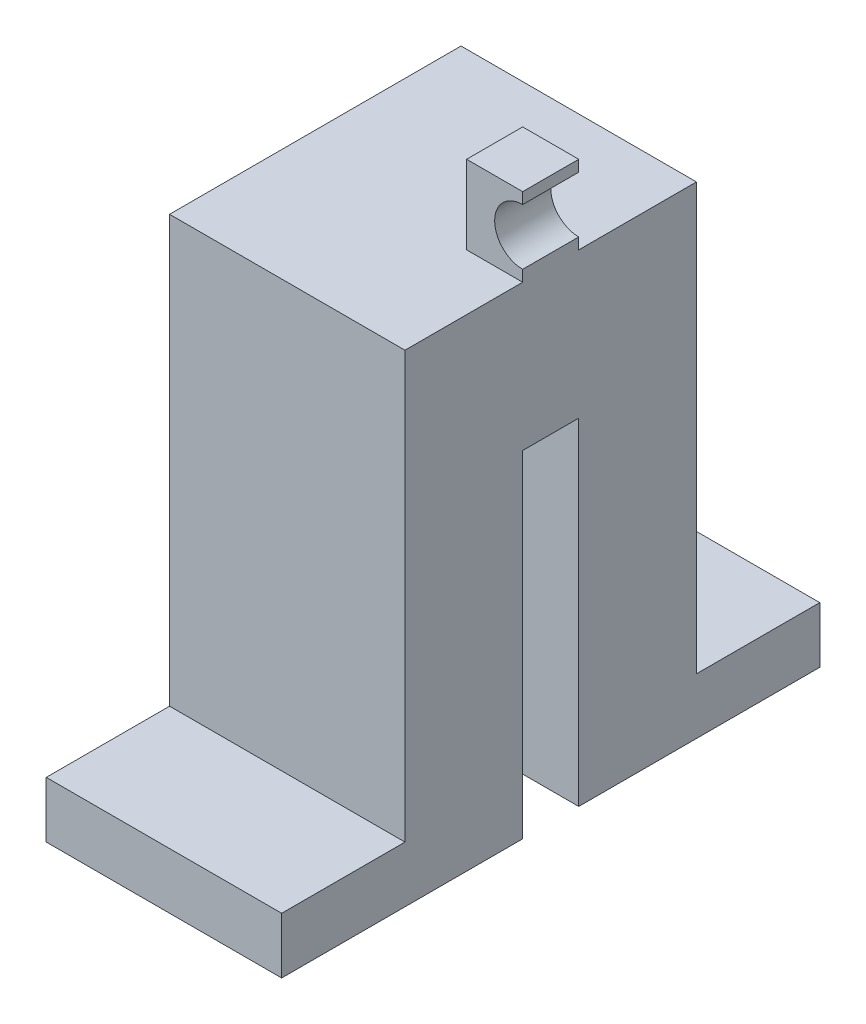
ISO-10303-21;
HEADER;
FILE_DESCRIPTION(('STEP AP214'),'2;1');
FILE_NAME('part.step','',(''),(''),'','','');
FILE_SCHEMA(('AUTOMOTIVE_DESIGN { 1 0 10303 214 1 1 1 1 }'));
ENDSEC;
DATA;
#1=APPLICATION_CONTEXT('core data for automotive mechanical design processes');
#2=APPLICATION_PROTOCOL_DEFINITION('international standard','automotive_design',2000,#1);
#3=PRODUCT_CONTEXT('',#1,'mechanical');
#4=PRODUCT('Part','Part','',(#3));
#5=PRODUCT_RELATED_PRODUCT_CATEGORY('part','',(#4));
#6=PRODUCT_DEFINITION_FORMATION('','',#4);
#7=PRODUCT_DEFINITION_CONTEXT('part definition',#1,'design');
#8=PRODUCT_DEFINITION('design','',#6,#7);
#9=PRODUCT_DEFINITION_SHAPE('','',#8);
#10=(LENGTH_UNIT() NAMED_UNIT(*) SI_UNIT(.MILLI.,.METRE.));
#11=(NAMED_UNIT(*) PLANE_ANGLE_UNIT() SI_UNIT($,.RADIAN.));
#12=(NAMED_UNIT(*) SI_UNIT($,.STERADIAN.) SOLID_ANGLE_UNIT());
#13=UNCERTAINTY_MEASURE_WITH_UNIT(LENGTH_MEASURE(1.E-05),#10,'distance_accuracy_value','');
#14=(GEOMETRIC_REPRESENTATION_CONTEXT(3) GLOBAL_UNCERTAINTY_ASSIGNED_CONTEXT((#13)) GLOBAL_UNIT_ASSIGNED_CONTEXT((#10,
#11,#12)) REPRESENTATION_CONTEXT('',''));
#15=CARTESIAN_POINT('',(0.,0.,0.));
#16=DIRECTION('',(0.,0.,1.));
#17=DIRECTION('',(1.,0.,0.));
#18=AXIS2_PLACEMENT_3D('',#15,#16,#17);
#19=CARTESIAN_POINT('',(21.,50.,-8.5));
#20=DIRECTION('',(1.,0.,0.));
#21=DIRECTION('',(0.,0.,-1.));
#22=AXIS2_PLACEMENT_3D('',#19,#20,#21);
#23=PLANE('',#22);
#24=DIRECTION('',(0.,0.,-1.));
#25=VECTOR('',#24,1.);
#26=CARTESIAN_POINT('',(21.,43.,2.5));
#27=LINE('',#26,#25);
#28=CARTESIAN_POINT('',(21.,43.,13.));
#29=VERTEX_POINT('',#28);
#30=CARTESIAN_POINT('',(21.,43.,2.5));
#31=VERTEX_POINT('',#30);
#32=EDGE_CURVE('E286',#29,#31,#27,.T.);
#33=ORIENTED_EDGE('',*,*,#32,.F.);
#34=DIRECTION('',(0.,-1.,0.));
#35=VECTOR('',#34,1.);
#36=CARTESIAN_POINT('',(21.,43.,13.));
#37=LINE('',#36,#35);
#38=CARTESIAN_POINT('',(21.,5.,13.));
#39=VERTEX_POINT('',#38);
#40=EDGE_CURVE('E265',#29,#39,#37,.T.);
#41=ORIENTED_EDGE('',*,*,#40,.T.);
#42=DIRECTION('',(0.,0.,-1.));
#43=VECTOR('',#42,1.);
#44=CARTESIAN_POINT('',(21.,5.,24.));
#45=LINE('',#44,#43);
#46=CARTESIAN_POINT('',(21.,5.,24.));
#47=VERTEX_POINT('',#46);
#48=EDGE_CURVE('E258',#47,#39,#45,.T.);
#49=ORIENTED_EDGE('',*,*,#48,.F.);
#50=DIRECTION('',(0.,1.,0.));
#51=VECTOR('',#50,1.);
#52=CARTESIAN_POINT('',(21.,0.,24.));
#53=LINE('',#52,#51);
#54=CARTESIAN_POINT('',(21.,0.,24.));
#55=VERTEX_POINT('',#54);
#56=EDGE_CURVE('E250',#55,#47,#53,.T.);
#57=ORIENTED_EDGE('',*,*,#56,.F.);
#58=DIRECTION('',(0.,0.,1.));
#59=VECTOR('',#58,1.);
#60=CARTESIAN_POINT('',(21.,0.,-8.5));
#61=LINE('',#60,#59);
#62=CARTESIAN_POINT('',(21.,0.,2.5));
#63=VERTEX_POINT('',#62);
#64=EDGE_CURVE('E362',#63,#55,#61,.T.);
#65=ORIENTED_EDGE('',*,*,#64,.F.);
#66=DIRECTION('',(0.,1.,0.));
#67=VECTOR('',#66,1.);
#68=CARTESIAN_POINT('',(21.,-73.0368057899577,2.5));
#69=LINE('',#68,#67);
#70=CARTESIAN_POINT('',(21.,30.,2.5));
#71=VERTEX_POINT('',#70);
#72=EDGE_CURVE('E312',#63,#71,#69,.T.);
#73=ORIENTED_EDGE('',*,*,#72,.T.);
#74=DIRECTION('',(0.,0.,1.));
#75=VECTOR('',#74,1.);
#76=CARTESIAN_POINT('',(21.,30.,-8.5));
#77=LINE('',#76,#75);
#78=CARTESIAN_POINT('',(21.,30.,-2.5));
#79=VERTEX_POINT('',#78);
#80=EDGE_CURVE('E308',#79,#71,#77,.T.);
#81=ORIENTED_EDGE('',*,*,#80,.F.);
#82=DIRECTION('',(0.,1.,0.));
#83=VECTOR('',#82,1.);
#84=CARTESIAN_POINT('',(21.,-73.0368057899577,-2.5));
#85=LINE('',#84,#83);
#86=CARTESIAN_POINT('',(21.,0.,-2.5));
#87=VERTEX_POINT('',#86);
#88=EDGE_CURVE('E325',#87,#79,#85,.T.);
#89=ORIENTED_EDGE('',*,*,#88,.F.);
#90=CARTESIAN_POINT('',(21.,0.,-24.));
#91=VERTEX_POINT('',#90);
#92=EDGE_CURVE('E223',#91,#87,#61,.T.);
#93=ORIENTED_EDGE('',*,*,#92,.F.);
#94=DIRECTION('',(0.,-1.,0.));
#95=VECTOR('',#94,1.);
#96=CARTESIAN_POINT('',(21.,5.,-24.));
#97=LINE('',#96,#95);
#98=CARTESIAN_POINT('',(21.,5.,-24.));
#99=VERTEX_POINT('',#98);
#100=EDGE_CURVE('E237',#99,#91,#97,.T.);
#101=ORIENTED_EDGE('',*,*,#100,.F.);
#102=DIRECTION('',(0.,0.,1.));
#103=VECTOR('',#102,1.);
#104=CARTESIAN_POINT('',(21.,5.,-24.));
#105=LINE('',#104,#103);
#106=CARTESIAN_POINT('',(21.,5.,-13.));
#107=VERTEX_POINT('',#106);
#108=EDGE_CURVE('E242',#99,#107,#105,.T.);
#109=ORIENTED_EDGE('',*,*,#108,.T.);
#110=DIRECTION('',(0.,-1.,0.));
#111=VECTOR('',#110,1.);
#112=CARTESIAN_POINT('',(21.,43.,-13.));
#113=LINE('',#112,#111);
#114=CARTESIAN_POINT('',(21.,43.,-13.));
#115=VERTEX_POINT('',#114);
#116=EDGE_CURVE('E272',#115,#107,#113,.T.);
#117=ORIENTED_EDGE('',*,*,#116,.F.);
#118=DIRECTION('',(0.,0.,-1.));
#119=VECTOR('',#118,1.);
#120=CARTESIAN_POINT('',(21.,43.,-2.5));
#121=LINE('',#120,#119);
#122=CARTESIAN_POINT('',(21.,43.,-2.5));
#123=VERTEX_POINT('',#122);
#124=EDGE_CURVE('E292',#123,#115,#121,.T.);
#125=ORIENTED_EDGE('',*,*,#124,.F.);
#126=DIRECTION('',(0.,-1.,0.));
#127=VECTOR('',#126,1.);
#128=CARTESIAN_POINT('',(21.,50.,-2.5));
#129=LINE('',#128,#127);
#130=CARTESIAN_POINT('',(21.,44.,-2.5));
#131=VERTEX_POINT('',#130);
#132=EDGE_CURVE('E293',#131,#123,#129,.T.);
#133=ORIENTED_EDGE('',*,*,#132,.F.);
#134=DIRECTION('',(0.,0.,-1.));
#135=VECTOR('',#134,1.);
#136=CARTESIAN_POINT('',(21.,44.,27.5));
#137=LINE('',#136,#135);
#138=CARTESIAN_POINT('',(21.,44.,2.5));
#139=VERTEX_POINT('',#138);
#140=EDGE_CURVE('E12',#139,#131,#137,.T.);
#141=ORIENTED_EDGE('',*,*,#140,.F.);
#142=DIRECTION('',(0.,1.,0.));
#143=VECTOR('',#142,1.);
#144=CARTESIAN_POINT('',(21.,50.,2.5));
#145=LINE('',#144,#143);
#146=EDGE_CURVE('E301',#31,#139,#145,.T.);
#147=ORIENTED_EDGE('',*,*,#146,.F.);
#148=EDGE_LOOP('',(#33,#41,#49,#57,#65,#73,#81,#89,#93,#101,#109,#117,#125,#133,#141,#147));
#149=FACE_BOUND('',#148,.T.);
#150=ADVANCED_FACE('F61',(#149),#23,.T.);
#151=CARTESIAN_POINT('',(0.,0.,0.));
#152=DIRECTION('',(0.,-1.,0.));
#153=DIRECTION('',(0.,0.,-1.));
#154=AXIS2_PLACEMENT_3D('',#151,#152,#153);
#155=PLANE('',#154);
#156=ORIENTED_EDGE('',*,*,#64,.T.);
#157=DIRECTION('',(1.,0.,0.));
#158=VECTOR('',#157,1.);
#159=CARTESIAN_POINT('',(0.,0.,24.));
#160=LINE('',#159,#158);
#161=CARTESIAN_POINT('',(0.,0.,24.));
#162=VERTEX_POINT('',#161);
#163=EDGE_CURVE('E218',#162,#55,#160,.T.);
#164=ORIENTED_EDGE('',*,*,#163,.F.);
#165=DIRECTION('',(0.,0.,-1.));
#166=VECTOR('',#165,1.);
#167=CARTESIAN_POINT('',(0.,0.,-1.));
#168=LINE('',#167,#166);
#169=CARTESIAN_POINT('',(0.,0.,-24.));
#170=VERTEX_POINT('',#169);
#171=EDGE_CURVE('E211',#162,#170,#168,.T.);
#172=ORIENTED_EDGE('',*,*,#171,.T.);
#173=DIRECTION('',(-1.,0.,0.));
#174=VECTOR('',#173,1.);
#175=CARTESIAN_POINT('',(21.,0.,-24.));
#176=LINE('',#175,#174);
#177=EDGE_CURVE('E216',#91,#170,#176,.T.);
#178=ORIENTED_EDGE('',*,*,#177,.F.);
#179=ORIENTED_EDGE('',*,*,#92,.T.);
#180=DIRECTION('',(1.,0.,0.));
#181=VECTOR('',#180,1.);
#182=CARTESIAN_POINT('',(21.,0.,-2.5));
#183=LINE('',#182,#181);
#184=CARTESIAN_POINT('',(14.,0.,-2.5));
#185=VERTEX_POINT('',#184);
#186=EDGE_CURVE('E315',#185,#87,#183,.T.);
#187=ORIENTED_EDGE('',*,*,#186,.F.);
#188=DIRECTION('',(0.,0.,-1.));
#189=VECTOR('',#188,1.);
#190=CARTESIAN_POINT('',(14.,0.,2.5));
#191=LINE('',#190,#189);
#192=CARTESIAN_POINT('',(14.,0.,2.5));
#193=VERTEX_POINT('',#192);
#194=EDGE_CURVE('E311',#193,#185,#191,.T.);
#195=ORIENTED_EDGE('',*,*,#194,.F.);
#196=DIRECTION('',(-1.,0.,0.));
#197=VECTOR('',#196,1.);
#198=CARTESIAN_POINT('',(21.,0.,2.5));
#199=LINE('',#198,#197);
#200=EDGE_CURVE('E309',#63,#193,#199,.T.);
#201=ORIENTED_EDGE('',*,*,#200,.F.);
#202=EDGE_LOOP('',(#156,#164,#172,#178,#179,#187,#195,#201));
#203=FACE_BOUND('',#202,.T.);
#204=DIRECTION('',(0.,0.,1.));
#205=VECTOR('',#204,1.);
#206=CARTESIAN_POINT('',(11.,0.,3.5));
#207=LINE('',#206,#205);
#208=CARTESIAN_POINT('',(11.,0.,-3.5));
#209=VERTEX_POINT('',#208);
#210=CARTESIAN_POINT('',(11.,0.,3.5));
#211=VERTEX_POINT('',#210);
#212=EDGE_CURVE('E318',#209,#211,#207,.T.);
#213=ORIENTED_EDGE('',*,*,#212,.F.);
#214=DIRECTION('',(1.,0.,0.));
#215=VECTOR('',#214,1.);
#216=CARTESIAN_POINT('',(3.,0.,-3.5));
#217=LINE('',#216,#215);
#218=CARTESIAN_POINT('',(3.,0.,-3.5));
#219=VERTEX_POINT('',#218);
#220=EDGE_CURVE('E341',#219,#209,#217,.T.);
#221=ORIENTED_EDGE('',*,*,#220,.F.);
#222=DIRECTION('',(0.,0.,-1.));
#223=VECTOR('',#222,1.);
#224=CARTESIAN_POINT('',(3.,0.,-3.5));
#225=LINE('',#224,#223);
#226=CARTESIAN_POINT('',(3.,0.,3.5));
#227=VERTEX_POINT('',#226);
#228=EDGE_CURVE('E355',#227,#219,#225,.T.);
#229=ORIENTED_EDGE('',*,*,#228,.F.);
#230=DIRECTION('',(-1.,0.,0.));
#231=VECTOR('',#230,1.);
#232=CARTESIAN_POINT('',(3.,0.,3.5));
#233=LINE('',#232,#231);
#234=EDGE_CURVE('E352',#211,#227,#233,.T.);
#235=ORIENTED_EDGE('',*,*,#234,.F.);
#236=EDGE_LOOP('',(#213,#221,#229,#235));
#237=FACE_BOUND('',#236,.T.);
#238=ADVANCED_FACE('F213',(#203,#237),#155,.T.);
#239=CARTESIAN_POINT('',(-9.,43.,-2.5));
#240=DIRECTION('',(0.,-1.,0.));
#241=DIRECTION('',(0.,0.,-1.));
#242=AXIS2_PLACEMENT_3D('',#239,#240,#241);
#243=PLANE('',#242);
#244=ORIENTED_EDGE('',*,*,#124,.T.);
#245=DIRECTION('',(1.,0.,0.));
#246=VECTOR('',#245,1.);
#247=CARTESIAN_POINT('',(0.,43.,-13.));
#248=LINE('',#247,#246);
#249=CARTESIAN_POINT('',(0.,43.,-13.));
#250=VERTEX_POINT('',#249);
#251=EDGE_CURVE('E267',#250,#115,#248,.T.);
#252=ORIENTED_EDGE('',*,*,#251,.F.);
#253=DIRECTION('',(0.,0.,1.));
#254=VECTOR('',#253,1.);
#255=CARTESIAN_POINT('',(0.,43.,8.5));
#256=LINE('',#255,#254);
#257=CARTESIAN_POINT('',(0.,43.,13.));
#258=VERTEX_POINT('',#257);
#259=EDGE_CURVE('E298',#250,#258,#256,.T.);
#260=ORIENTED_EDGE('',*,*,#259,.T.);
#261=DIRECTION('',(-1.,0.,0.));
#262=VECTOR('',#261,1.);
#263=CARTESIAN_POINT('',(0.,43.,13.));
#264=LINE('',#263,#262);
#265=EDGE_CURVE('E261',#29,#258,#264,.T.);
#266=ORIENTED_EDGE('',*,*,#265,.F.);
#267=ORIENTED_EDGE('',*,*,#32,.T.);
#268=DIRECTION('',(1.,0.,0.));
#269=VECTOR('',#268,1.);
#270=CARTESIAN_POINT('',(-9.,43.,2.5));
#271=LINE('',#270,#269);
#272=CARTESIAN_POINT('',(16.,43.,2.50000000000001));
#273=VERTEX_POINT('',#272);
#274=EDGE_CURVE('E304',#273,#31,#271,.T.);
#275=ORIENTED_EDGE('',*,*,#274,.F.);
#276=DIRECTION('',(0.,0.,1.));
#277=VECTOR('',#276,1.);
#278=CARTESIAN_POINT('',(16.,43.,-27.5));
#279=LINE('',#278,#277);
#280=CARTESIAN_POINT('',(16.,43.,-2.5));
#281=VERTEX_POINT('',#280);
#282=EDGE_CURVE('E284',#281,#273,#279,.T.);
#283=ORIENTED_EDGE('',*,*,#282,.F.);
#284=DIRECTION('',(1.,0.,0.));
#285=VECTOR('',#284,1.);
#286=CARTESIAN_POINT('',(-9.,43.,-2.5));
#287=LINE('',#286,#285);
#288=EDGE_CURVE('E295',#281,#123,#287,.T.);
#289=ORIENTED_EDGE('',*,*,#288,.T.);
#290=EDGE_LOOP('',(#244,#252,#260,#266,#267,#275,#283,#289));
#291=FACE_BOUND('',#290,.T.);
#292=ADVANCED_FACE('F398',(#291),#243,.F.);
#293=CARTESIAN_POINT('',(0.,50.,0.));
#294=DIRECTION('',(0.,-1.,0.));
#295=DIRECTION('',(0.,0.,-1.));
#296=AXIS2_PLACEMENT_3D('',#293,#294,#295);
#297=PLANE('',#296);
#298=DIRECTION('',(0.,0.,1.));
#299=VECTOR('',#298,1.);
#300=CARTESIAN_POINT('',(16.,50.,-27.5));
#301=LINE('',#300,#299);
#302=CARTESIAN_POINT('',(16.,50.,-2.5));
#303=VERTEX_POINT('',#302);
#304=CARTESIAN_POINT('',(16.,50.,2.50000000000001));
#305=VERTEX_POINT('',#304);
#306=EDGE_CURVE('E283',#303,#305,#301,.T.);
#307=ORIENTED_EDGE('',*,*,#306,.T.);
#308=DIRECTION('',(1.,0.,0.));
#309=VECTOR('',#308,1.);
#310=CARTESIAN_POINT('',(0.,50.,2.5));
#311=LINE('',#310,#309);
#312=CARTESIAN_POINT('',(21.,50.,2.5));
#313=VERTEX_POINT('',#312);
#314=EDGE_CURVE('E371',#305,#313,#311,.T.);
#315=ORIENTED_EDGE('',*,*,#314,.T.);
#316=DIRECTION('',(0.,0.,1.));
#317=VECTOR('',#316,1.);
#318=CARTESIAN_POINT('',(21.,50.,-8.5));
#319=LINE('',#318,#317);
#320=CARTESIAN_POINT('',(21.,50.,-2.5));
#321=VERTEX_POINT('',#320);
#322=EDGE_CURVE('E222',#321,#313,#319,.T.);
#323=ORIENTED_EDGE('',*,*,#322,.F.);
#324=DIRECTION('',(-1.,0.,0.));
#325=VECTOR('',#324,1.);
#326=CARTESIAN_POINT('',(0.,50.,-2.5));
#327=LINE('',#326,#325);
#328=EDGE_CURVE('E375',#321,#303,#327,.T.);
#329=ORIENTED_EDGE('',*,*,#328,.T.);
#330=EDGE_LOOP('',(#307,#315,#323,#329));
#331=FACE_BOUND('',#330,.T.);
#332=ADVANCED_FACE('F393',(#331),#297,.F.);
#333=CARTESIAN_POINT('',(-9.,50.,2.5));
#334=DIRECTION('',(0.,0.,-1.));
#335=DIRECTION('',(0.,1.,0.));
#336=AXIS2_PLACEMENT_3D('',#333,#334,#335);
#337=PLANE('',#336);
#338=ORIENTED_EDGE('',*,*,#146,.T.);
#339=CARTESIAN_POINT('',(21.,46.5,2.5));
#340=DIRECTION('',(0.,0.,-1.));
#341=DIRECTION('',(0.,1.,0.));
#342=AXIS2_PLACEMENT_3D('',#339,#340,#341);
#343=CIRCLE('',#342,2.5);
#344=CARTESIAN_POINT('',(21.,49.,2.5));
#345=VERTEX_POINT('',#344);
#346=EDGE_CURVE('E277',#139,#345,#343,.T.);
#347=ORIENTED_EDGE('',*,*,#346,.T.);
#348=EDGE_CURVE('E300',#345,#313,#145,.T.);
#349=ORIENTED_EDGE('',*,*,#348,.T.);
#350=ORIENTED_EDGE('',*,*,#314,.F.);
#351=DIRECTION('',(0.,-1.,0.));
#352=VECTOR('',#351,1.);
#353=CARTESIAN_POINT('',(16.,0.,2.50000000000001));
#354=LINE('',#353,#352);
#355=EDGE_CURVE('E280',#305,#273,#354,.T.);
#356=ORIENTED_EDGE('',*,*,#355,.T.);
#357=ORIENTED_EDGE('',*,*,#274,.T.);
#358=EDGE_LOOP('',(#338,#347,#349,#350,#356,#357));
#359=FACE_BOUND('',#358,.T.);
#360=ADVANCED_FACE('F388',(#359),#337,.F.);
#361=CARTESIAN_POINT('',(-9.,50.,-2.5));
#362=DIRECTION('',(0.,0.,1.));
#363=DIRECTION('',(0.,-1.,0.));
#364=AXIS2_PLACEMENT_3D('',#361,#362,#363);
#365=PLANE('',#364);
#366=CARTESIAN_POINT('',(21.,49.,-2.5));
#367=VERTEX_POINT('',#366);
#368=EDGE_CURVE('E289',#321,#367,#129,.T.);
#369=ORIENTED_EDGE('',*,*,#368,.T.);
#370=CARTESIAN_POINT('',(21.,46.5,-2.5));
#371=DIRECTION('',(0.,0.,-1.));
#372=DIRECTION('',(0.,1.,0.));
#373=AXIS2_PLACEMENT_3D('',#370,#371,#372);
#374=CIRCLE('',#373,2.5);
#375=EDGE_CURVE('E274',#131,#367,#374,.T.);
#376=ORIENTED_EDGE('',*,*,#375,.F.);
#377=ORIENTED_EDGE('',*,*,#132,.T.);
#378=ORIENTED_EDGE('',*,*,#288,.F.);
#379=DIRECTION('',(0.,-1.,0.));
#380=VECTOR('',#379,1.);
#381=CARTESIAN_POINT('',(16.,50.,-2.5));
#382=LINE('',#381,#380);
#383=EDGE_CURVE('E378',#303,#281,#382,.T.);
#384=ORIENTED_EDGE('',*,*,#383,.F.);
#385=ORIENTED_EDGE('',*,*,#328,.F.);
#386=EDGE_LOOP('',(#369,#376,#377,#378,#384,#385));
#387=FACE_BOUND('',#386,.T.);
#388=ADVANCED_FACE('F449',(#387),#365,.F.);
#389=DIRECTION('',(0.,0.,-1.));
#390=VECTOR('',#389,1.);
#391=CARTESIAN_POINT('',(21.,49.,27.5));
#392=LINE('',#391,#390);
#393=EDGE_CURVE('E69',#367,#345,#392,.F.);
#394=ORIENTED_EDGE('',*,*,#393,.F.);
#395=ORIENTED_EDGE('',*,*,#368,.F.);
#396=ORIENTED_EDGE('',*,*,#322,.T.);
#397=ORIENTED_EDGE('',*,*,#348,.F.);
#398=EDGE_LOOP('',(#394,#395,#396,#397));
#399=FACE_BOUND('',#398,.T.);
#400=ADVANCED_FACE('F63',(#399),#23,.T.);
#401=CARTESIAN_POINT('',(0.,50.,-1.));
#402=DIRECTION('',(-1.,0.,0.));
#403=DIRECTION('',(0.,0.,1.));
#404=AXIS2_PLACEMENT_3D('',#401,#402,#403);
#405=PLANE('',#404);
#406=ORIENTED_EDGE('',*,*,#259,.F.);
#407=DIRECTION('',(0.,-1.,0.));
#408=VECTOR('',#407,1.);
#409=CARTESIAN_POINT('',(0.,43.,-13.));
#410=LINE('',#409,#408);
#411=CARTESIAN_POINT('',(0.,5.,-13.));
#412=VERTEX_POINT('',#411);
#413=EDGE_CURVE('E271',#250,#412,#410,.T.);
#414=ORIENTED_EDGE('',*,*,#413,.T.);
#415=DIRECTION('',(0.,0.,1.));
#416=VECTOR('',#415,1.);
#417=CARTESIAN_POINT('',(0.,5.,-24.));
#418=LINE('',#417,#416);
#419=CARTESIAN_POINT('',(0.,5.,-24.));
#420=VERTEX_POINT('',#419);
#421=EDGE_CURVE('E229',#420,#412,#418,.T.);
#422=ORIENTED_EDGE('',*,*,#421,.F.);
#423=DIRECTION('',(0.,1.,0.));
#424=VECTOR('',#423,1.);
#425=CARTESIAN_POINT('',(0.,0.,-24.));
#426=LINE('',#425,#424);
#427=EDGE_CURVE('E226',#170,#420,#426,.T.);
#428=ORIENTED_EDGE('',*,*,#427,.F.);
#429=ORIENTED_EDGE('',*,*,#171,.F.);
#430=DIRECTION('',(0.,-1.,0.));
#431=VECTOR('',#430,1.);
#432=CARTESIAN_POINT('',(0.,5.,24.));
#433=LINE('',#432,#431);
#434=CARTESIAN_POINT('',(0.,5.,24.));
#435=VERTEX_POINT('',#434);
#436=EDGE_CURVE('E247',#435,#162,#433,.T.);
#437=ORIENTED_EDGE('',*,*,#436,.F.);
#438=DIRECTION('',(0.,0.,-1.));
#439=VECTOR('',#438,1.);
#440=CARTESIAN_POINT('',(0.,5.,24.));
#441=LINE('',#440,#439);
#442=CARTESIAN_POINT('',(0.,5.,13.));
#443=VERTEX_POINT('',#442);
#444=EDGE_CURVE('E254',#435,#443,#441,.T.);
#445=ORIENTED_EDGE('',*,*,#444,.T.);
#446=DIRECTION('',(0.,-1.,0.));
#447=VECTOR('',#446,1.);
#448=CARTESIAN_POINT('',(0.,43.,13.));
#449=LINE('',#448,#447);
#450=EDGE_CURVE('E264',#258,#443,#449,.T.);
#451=ORIENTED_EDGE('',*,*,#450,.F.);
#452=EDGE_LOOP('',(#406,#414,#422,#428,#429,#437,#445,#451));
#453=FACE_BOUND('',#452,.T.);
#454=ADVANCED_FACE('F227',(#453),#405,.T.);
#455=CARTESIAN_POINT('',(11.,31.3896424388864,3.5));
#456=DIRECTION('',(1.,0.,0.));
#457=DIRECTION('',(0.,0.,-1.));
#458=AXIS2_PLACEMENT_3D('',#455,#456,#457);
#459=PLANE('',#458);
#460=ORIENTED_EDGE('',*,*,#212,.T.);
#461=DIRECTION('',(0.,-1.,0.));
#462=VECTOR('',#461,1.);
#463=CARTESIAN_POINT('',(11.,31.3896424388864,3.5));
#464=LINE('',#463,#462);
#465=CARTESIAN_POINT('',(11.,31.3896424388864,3.5));
#466=VERTEX_POINT('',#465);
#467=EDGE_CURVE('E350',#466,#211,#464,.T.);
#468=ORIENTED_EDGE('',*,*,#467,.F.);
#469=DIRECTION('',(0.,0.,1.));
#470=VECTOR('',#469,1.);
#471=CARTESIAN_POINT('',(11.,31.3896424388864,3.5));
#472=LINE('',#471,#470);
#473=CARTESIAN_POINT('',(11.,31.3896424388864,-3.5));
#474=VERTEX_POINT('',#473);
#475=EDGE_CURVE('E337',#474,#466,#472,.T.);
#476=ORIENTED_EDGE('',*,*,#475,.F.);
#477=DIRECTION('',(0.,-1.,0.));
#478=VECTOR('',#477,1.);
#479=CARTESIAN_POINT('',(11.,31.3896424388864,-3.5));
#480=LINE('',#479,#478);
#481=EDGE_CURVE('E360',#474,#209,#480,.T.);
#482=ORIENTED_EDGE('',*,*,#481,.T.);
#483=EDGE_LOOP('',(#460,#468,#476,#482));
#484=FACE_BOUND('',#483,.T.);
#485=ADVANCED_FACE('F454',(#484),#459,.F.);
#486=CARTESIAN_POINT('',(3.,31.3896424388864,-3.5));
#487=DIRECTION('',(0.,0.,-1.));
#488=DIRECTION('',(-1.,0.,0.));
#489=AXIS2_PLACEMENT_3D('',#486,#487,#488);
#490=PLANE('',#489);
#491=ORIENTED_EDGE('',*,*,#220,.T.);
#492=ORIENTED_EDGE('',*,*,#481,.F.);
#493=DIRECTION('',(1.,0.,0.));
#494=VECTOR('',#493,1.);
#495=CARTESIAN_POINT('',(3.,31.3896424388864,-3.5));
#496=LINE('',#495,#494);
#497=CARTESIAN_POINT('',(3.,31.3896424388864,-3.5));
#498=VERTEX_POINT('',#497);
#499=EDGE_CURVE('E347',#498,#474,#496,.T.);
#500=ORIENTED_EDGE('',*,*,#499,.F.);
#501=DIRECTION('',(0.,-1.,0.));
#502=VECTOR('',#501,1.);
#503=CARTESIAN_POINT('',(3.,31.3896424388864,-3.5));
#504=LINE('',#503,#502);
#505=EDGE_CURVE('E363',#498,#219,#504,.T.);
#506=ORIENTED_EDGE('',*,*,#505,.T.);
#507=EDGE_LOOP('',(#491,#492,#500,#506));
#508=FACE_BOUND('',#507,.T.);
#509=ADVANCED_FACE('F478',(#508),#490,.F.);
#510=CARTESIAN_POINT('',(3.,31.3896424388864,-3.5));
#511=DIRECTION('',(-1.,0.,0.));
#512=DIRECTION('',(0.,0.,1.));
#513=AXIS2_PLACEMENT_3D('',#510,#511,#512);
#514=PLANE('',#513);
#515=ORIENTED_EDGE('',*,*,#228,.T.);
#516=ORIENTED_EDGE('',*,*,#505,.F.);
#517=DIRECTION('',(0.,0.,-1.));
#518=VECTOR('',#517,1.);
#519=CARTESIAN_POINT('',(3.,31.3896424388864,-3.5));
#520=LINE('',#519,#518);
#521=CARTESIAN_POINT('',(3.,31.3896424388864,3.5));
#522=VERTEX_POINT('',#521);
#523=EDGE_CURVE('E344',#522,#498,#520,.T.);
#524=ORIENTED_EDGE('',*,*,#523,.F.);
#525=DIRECTION('',(0.,-1.,0.));
#526=VECTOR('',#525,1.);
#527=CARTESIAN_POINT('',(3.,31.3896424388864,3.5));
#528=LINE('',#527,#526);
#529=EDGE_CURVE('E365',#522,#227,#528,.T.);
#530=ORIENTED_EDGE('',*,*,#529,.T.);
#531=EDGE_LOOP('',(#515,#516,#524,#530));
#532=FACE_BOUND('',#531,.T.);
#533=ADVANCED_FACE('F481',(#532),#514,.F.);
#534=CARTESIAN_POINT('',(3.,31.3896424388864,3.5));
#535=DIRECTION('',(0.,0.,1.));
#536=DIRECTION('',(1.,0.,0.));
#537=AXIS2_PLACEMENT_3D('',#534,#535,#536);
#538=PLANE('',#537);
#539=ORIENTED_EDGE('',*,*,#234,.T.);
#540=ORIENTED_EDGE('',*,*,#529,.F.);
#541=DIRECTION('',(-1.,0.,0.));
#542=VECTOR('',#541,1.);
#543=CARTESIAN_POINT('',(3.,31.3896424388864,3.5));
#544=LINE('',#543,#542);
#545=EDGE_CURVE('E340',#466,#522,#544,.T.);
#546=ORIENTED_EDGE('',*,*,#545,.F.);
#547=ORIENTED_EDGE('',*,*,#467,.T.);
#548=EDGE_LOOP('',(#539,#540,#546,#547));
#549=FACE_BOUND('',#548,.T.);
#550=ADVANCED_FACE('F476',(#549),#538,.F.);
#551=CARTESIAN_POINT('',(0.,31.3896424388864,0.));
#552=DIRECTION('',(0.,-1.,0.));
#553=DIRECTION('',(0.,0.,-1.));
#554=AXIS2_PLACEMENT_3D('',#551,#552,#553);
#555=PLANE('',#554);
#556=ORIENTED_EDGE('',*,*,#475,.T.);
#557=ORIENTED_EDGE('',*,*,#545,.T.);
#558=ORIENTED_EDGE('',*,*,#523,.T.);
#559=ORIENTED_EDGE('',*,*,#499,.T.);
#560=EDGE_LOOP('',(#556,#557,#558,#559));
#561=FACE_BOUND('',#560,.T.);
#562=ADVANCED_FACE('F466',(#561),#555,.T.);
#563=CARTESIAN_POINT('',(21.,-73.0368057899577,2.5));
#564=DIRECTION('',(0.,0.,-1.));
#565=DIRECTION('',(-1.,0.,0.));
#566=AXIS2_PLACEMENT_3D('',#563,#564,#565);
#567=PLANE('',#566);
#568=ORIENTED_EDGE('',*,*,#72,.F.);
#569=ORIENTED_EDGE('',*,*,#200,.T.);
#570=DIRECTION('',(0.,1.,0.));
#571=VECTOR('',#570,1.);
#572=CARTESIAN_POINT('',(14.,-73.0368057899577,2.5));
#573=LINE('',#572,#571);
#574=CARTESIAN_POINT('',(14.,30.,2.5));
#575=VERTEX_POINT('',#574);
#576=EDGE_CURVE('E331',#193,#575,#573,.T.);
#577=ORIENTED_EDGE('',*,*,#576,.T.);
#578=DIRECTION('',(-1.,0.,0.));
#579=VECTOR('',#578,1.);
#580=CARTESIAN_POINT('',(21.,30.,2.5));
#581=LINE('',#580,#579);
#582=EDGE_CURVE('E323',#71,#575,#581,.T.);
#583=ORIENTED_EDGE('',*,*,#582,.F.);
#584=EDGE_LOOP('',(#568,#569,#577,#583));
#585=FACE_BOUND('',#584,.T.);
#586=ADVANCED_FACE('F419',(#585),#567,.T.);
#587=CARTESIAN_POINT('',(14.,-73.0368057899577,2.5));
#588=DIRECTION('',(1.,0.,0.));
#589=DIRECTION('',(0.,0.,-1.));
#590=AXIS2_PLACEMENT_3D('',#587,#588,#589);
#591=PLANE('',#590);
#592=ORIENTED_EDGE('',*,*,#576,.F.);
#593=ORIENTED_EDGE('',*,*,#194,.T.);
#594=DIRECTION('',(0.,1.,0.));
#595=VECTOR('',#594,1.);
#596=CARTESIAN_POINT('',(14.,-73.0368057899577,-2.5));
#597=LINE('',#596,#595);
#598=CARTESIAN_POINT('',(14.,30.,-2.5));
#599=VERTEX_POINT('',#598);
#600=EDGE_CURVE('E328',#185,#599,#597,.T.);
#601=ORIENTED_EDGE('',*,*,#600,.T.);
#602=DIRECTION('',(0.,0.,-1.));
#603=VECTOR('',#602,1.);
#604=CARTESIAN_POINT('',(14.,30.,2.5));
#605=LINE('',#604,#603);
#606=EDGE_CURVE('E321',#575,#599,#605,.T.);
#607=ORIENTED_EDGE('',*,*,#606,.F.);
#608=EDGE_LOOP('',(#592,#593,#601,#607));
#609=FACE_BOUND('',#608,.T.);
#610=ADVANCED_FACE('F423',(#609),#591,.T.);
#611=CARTESIAN_POINT('',(21.,-73.0368057899577,-2.5));
#612=DIRECTION('',(0.,0.,1.));
#613=DIRECTION('',(1.,0.,0.));
#614=AXIS2_PLACEMENT_3D('',#611,#612,#613);
#615=PLANE('',#614);
#616=ORIENTED_EDGE('',*,*,#600,.F.);
#617=ORIENTED_EDGE('',*,*,#186,.T.);
#618=ORIENTED_EDGE('',*,*,#88,.T.);
#619=DIRECTION('',(1.,0.,0.));
#620=VECTOR('',#619,1.);
#621=CARTESIAN_POINT('',(21.,30.,-2.5));
#622=LINE('',#621,#620);
#623=EDGE_CURVE('E319',#599,#79,#622,.T.);
#624=ORIENTED_EDGE('',*,*,#623,.F.);
#625=EDGE_LOOP('',(#616,#617,#618,#624));
#626=FACE_BOUND('',#625,.T.);
#627=ADVANCED_FACE('F428',(#626),#615,.T.);
#628=CARTESIAN_POINT('',(0.,30.,0.));
#629=DIRECTION('',(0.,-1.,0.));
#630=DIRECTION('',(0.,0.,-1.));
#631=AXIS2_PLACEMENT_3D('',#628,#629,#630);
#632=PLANE('',#631);
#633=ORIENTED_EDGE('',*,*,#623,.T.);
#634=ORIENTED_EDGE('',*,*,#80,.T.);
#635=ORIENTED_EDGE('',*,*,#582,.T.);
#636=ORIENTED_EDGE('',*,*,#606,.T.);
#637=EDGE_LOOP('',(#633,#634,#635,#636));
#638=FACE_BOUND('',#637,.T.);
#639=ADVANCED_FACE('F426',(#638),#632,.T.);
#640=CARTESIAN_POINT('',(16.,0.,-27.5));
#641=DIRECTION('',(-1.,0.,0.));
#642=DIRECTION('',(0.,-1.,0.));
#643=AXIS2_PLACEMENT_3D('',#640,#641,#642);
#644=PLANE('',#643);
#645=ORIENTED_EDGE('',*,*,#383,.T.);
#646=ORIENTED_EDGE('',*,*,#282,.T.);
#647=ORIENTED_EDGE('',*,*,#355,.F.);
#648=ORIENTED_EDGE('',*,*,#306,.F.);
#649=EDGE_LOOP('',(#645,#646,#647,#648));
#650=FACE_BOUND('',#649,.T.);
#651=ADVANCED_FACE('F473',(#650),#644,.T.);
#652=CARTESIAN_POINT('',(21.,46.5,27.5));
#653=DIRECTION('',(0.,0.,-1.));
#654=DIRECTION('',(0.,1.,0.));
#655=AXIS2_PLACEMENT_3D('',#652,#653,#654);
#656=CYLINDRICAL_SURFACE('',#655,2.5);
#657=ORIENTED_EDGE('',*,*,#140,.T.);
#658=ORIENTED_EDGE('',*,*,#375,.T.);
#659=ORIENTED_EDGE('',*,*,#393,.T.);
#660=ORIENTED_EDGE('',*,*,#346,.F.);
#661=EDGE_LOOP('',(#657,#658,#659,#660));
#662=FACE_BOUND('',#661,.T.);
#663=ADVANCED_FACE('F381',(#662),#656,.F.);
#664=CARTESIAN_POINT('',(0.,43.,-13.));
#665=DIRECTION('',(0.,0.,-1.));
#666=DIRECTION('',(-1.,0.,0.));
#667=AXIS2_PLACEMENT_3D('',#664,#665,#666);
#668=PLANE('',#667);
#669=DIRECTION('',(1.,0.,0.));
#670=VECTOR('',#669,1.);
#671=CARTESIAN_POINT('',(0.,5.,-13.));
#672=LINE('',#671,#670);
#673=EDGE_CURVE('E76',#412,#107,#672,.T.);
#674=ORIENTED_EDGE('',*,*,#673,.F.);
#675=ORIENTED_EDGE('',*,*,#413,.F.);
#676=ORIENTED_EDGE('',*,*,#251,.T.);
#677=ORIENTED_EDGE('',*,*,#116,.T.);
#678=EDGE_LOOP('',(#674,#675,#676,#677));
#679=FACE_BOUND('',#678,.T.);
#680=ADVANCED_FACE('F521',(#679),#668,.T.);
#681=CARTESIAN_POINT('',(0.,43.,13.));
#682=DIRECTION('',(0.,0.,1.));
#683=DIRECTION('',(1.,0.,0.));
#684=AXIS2_PLACEMENT_3D('',#681,#682,#683);
#685=PLANE('',#684);
#686=DIRECTION('',(-1.,0.,0.));
#687=VECTOR('',#686,1.);
#688=CARTESIAN_POINT('',(21.,5.,13.));
#689=LINE('',#688,#687);
#690=EDGE_CURVE('E84',#39,#443,#689,.T.);
#691=ORIENTED_EDGE('',*,*,#690,.F.);
#692=ORIENTED_EDGE('',*,*,#40,.F.);
#693=ORIENTED_EDGE('',*,*,#265,.T.);
#694=ORIENTED_EDGE('',*,*,#450,.T.);
#695=EDGE_LOOP('',(#691,#692,#693,#694));
#696=FACE_BOUND('',#695,.T.);
#697=ADVANCED_FACE('F403',(#696),#685,.T.);
#698=CARTESIAN_POINT('',(21.,5.,24.));
#699=DIRECTION('',(0.,-1.,0.));
#700=DIRECTION('',(1.,0.,0.));
#701=AXIS2_PLACEMENT_3D('',#698,#699,#700);
#702=PLANE('',#701);
#703=ORIENTED_EDGE('',*,*,#690,.T.);
#704=ORIENTED_EDGE('',*,*,#444,.F.);
#705=DIRECTION('',(-1.,0.,0.));
#706=VECTOR('',#705,1.);
#707=CARTESIAN_POINT('',(21.,5.,24.));
#708=LINE('',#707,#706);
#709=EDGE_CURVE('E252',#47,#435,#708,.T.);
#710=ORIENTED_EDGE('',*,*,#709,.F.);
#711=ORIENTED_EDGE('',*,*,#48,.T.);
#712=EDGE_LOOP('',(#703,#704,#710,#711));
#713=FACE_BOUND('',#712,.T.);
#714=ADVANCED_FACE('F407',(#713),#702,.F.);
#715=CARTESIAN_POINT('',(0.,0.,24.));
#716=DIRECTION('',(0.,0.,1.));
#717=DIRECTION('',(1.,0.,0.));
#718=AXIS2_PLACEMENT_3D('',#715,#716,#717);
#719=PLANE('',#718);
#720=ORIENTED_EDGE('',*,*,#436,.T.);
#721=ORIENTED_EDGE('',*,*,#163,.T.);
#722=ORIENTED_EDGE('',*,*,#56,.T.);
#723=ORIENTED_EDGE('',*,*,#709,.T.);
#724=EDGE_LOOP('',(#720,#721,#722,#723));
#725=FACE_BOUND('',#724,.T.);
#726=ADVANCED_FACE('F410',(#725),#719,.T.);
#727=CARTESIAN_POINT('',(0.,5.,-24.));
#728=DIRECTION('',(0.,-1.,0.));
#729=DIRECTION('',(1.,0.,0.));
#730=AXIS2_PLACEMENT_3D('',#727,#728,#729);
#731=PLANE('',#730);
#732=ORIENTED_EDGE('',*,*,#673,.T.);
#733=ORIENTED_EDGE('',*,*,#108,.F.);
#734=DIRECTION('',(1.,0.,0.));
#735=VECTOR('',#734,1.);
#736=CARTESIAN_POINT('',(0.,5.,-24.));
#737=LINE('',#736,#735);
#738=EDGE_CURVE('E232',#420,#99,#737,.T.);
#739=ORIENTED_EDGE('',*,*,#738,.F.);
#740=ORIENTED_EDGE('',*,*,#421,.T.);
#741=EDGE_LOOP('',(#732,#733,#739,#740));
#742=FACE_BOUND('',#741,.T.);
#743=ADVANCED_FACE('F434',(#742),#731,.F.);
#744=CARTESIAN_POINT('',(0.,0.,-24.));
#745=DIRECTION('',(0.,0.,-1.));
#746=DIRECTION('',(-1.,0.,0.));
#747=AXIS2_PLACEMENT_3D('',#744,#745,#746);
#748=PLANE('',#747);
#749=ORIENTED_EDGE('',*,*,#177,.T.);
#750=ORIENTED_EDGE('',*,*,#427,.T.);
#751=ORIENTED_EDGE('',*,*,#738,.T.);
#752=ORIENTED_EDGE('',*,*,#100,.T.);
#753=EDGE_LOOP('',(#749,#750,#751,#752));
#754=FACE_BOUND('',#753,.T.);
#755=ADVANCED_FACE('F235',(#754),#748,.T.);
#756=CLOSED_SHELL('',(#150,#238,#292,#332,#360,#388,#400,#454,#485,#509,#533,#550,#562,#586,
#610,#627,#639,#651,#663,#680,#697,#714,#726,#743,#755));
#757=MANIFOLD_SOLID_BREP('B2',#756);
#758=ADVANCED_BREP_SHAPE_REPRESENTATION('',(#18,#757),#14);
#759=SHAPE_DEFINITION_REPRESENTATION(#9,#758);
ENDSEC;
END-ISO-10303-21;
